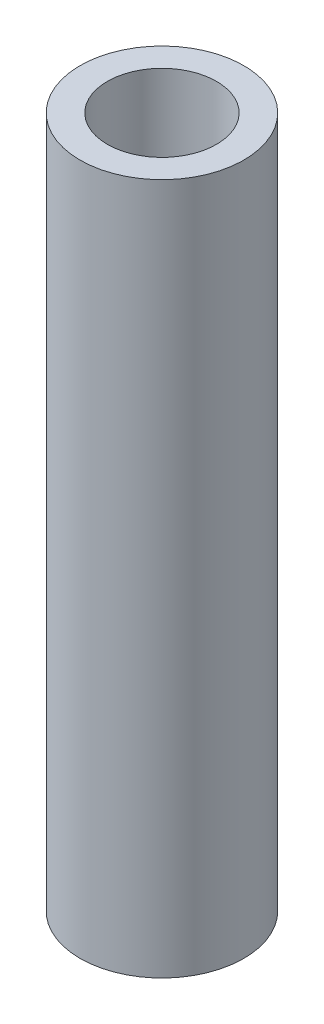
ISO-10303-21;
HEADER;
FILE_DESCRIPTION(('STEP AP214'),'2;1');
FILE_NAME('part.step','',(''),(''),'','','');
FILE_SCHEMA(('AUTOMOTIVE_DESIGN { 1 0 10303 214 1 1 1 1 }'));
ENDSEC;
DATA;
#1=APPLICATION_CONTEXT('core data for automotive mechanical design processes');
#2=APPLICATION_PROTOCOL_DEFINITION('international standard','automotive_design',2000,#1);
#3=PRODUCT_CONTEXT('',#1,'mechanical');
#4=PRODUCT('Part','Part','',(#3));
#5=PRODUCT_RELATED_PRODUCT_CATEGORY('part','',(#4));
#6=PRODUCT_DEFINITION_FORMATION('','',#4);
#7=PRODUCT_DEFINITION_CONTEXT('part definition',#1,'design');
#8=PRODUCT_DEFINITION('design','',#6,#7);
#9=PRODUCT_DEFINITION_SHAPE('','',#8);
#10=(LENGTH_UNIT() NAMED_UNIT(*) SI_UNIT(.MILLI.,.METRE.));
#11=(NAMED_UNIT(*) PLANE_ANGLE_UNIT() SI_UNIT($,.RADIAN.));
#12=(NAMED_UNIT(*) SI_UNIT($,.STERADIAN.) SOLID_ANGLE_UNIT());
#13=UNCERTAINTY_MEASURE_WITH_UNIT(LENGTH_MEASURE(1.E-05),#10,'distance_accuracy_value','');
#14=(GEOMETRIC_REPRESENTATION_CONTEXT(3) GLOBAL_UNCERTAINTY_ASSIGNED_CONTEXT((#13)) GLOBAL_UNIT_ASSIGNED_CONTEXT((#10,
#11,#12)) REPRESENTATION_CONTEXT('',''));
#15=CARTESIAN_POINT('',(0.,0.,0.));
#16=DIRECTION('',(0.,0.,1.));
#17=DIRECTION('',(1.,0.,0.));
#18=AXIS2_PLACEMENT_3D('',#15,#16,#17);
#19=CARTESIAN_POINT('',(0.,19.,0.));
#20=DIRECTION('',(0.,1.,0.));
#21=DIRECTION('',(0.,0.,1.));
#22=AXIS2_PLACEMENT_3D('',#19,#20,#21);
#23=PLANE('',#22);
#24=CARTESIAN_POINT('',(0.,19.,0.));
#25=DIRECTION('',(0.,1.,0.));
#26=DIRECTION('',(0.,0.,1.));
#27=AXIS2_PLACEMENT_3D('',#24,#25,#26);
#28=CIRCLE('',#27,2.25000000000009);
#29=CARTESIAN_POINT('',(0.,19.,2.25000000000009));
#30=VERTEX_POINT('',#29);
#31=EDGE_CURVE('E10',#30,#30,#28,.T.);
#32=ORIENTED_EDGE('',*,*,#31,.T.);
#33=EDGE_LOOP('',(#32));
#34=FACE_BOUND('',#33,.T.);
#35=CARTESIAN_POINT('',(0.,19.,0.));
#36=DIRECTION('',(0.,1.,0.));
#37=DIRECTION('',(0.,0.,1.));
#38=AXIS2_PLACEMENT_3D('',#35,#36,#37);
#39=CIRCLE('',#38,1.50000000000006);
#40=CARTESIAN_POINT('',(0.,19.,1.50000000000006));
#41=VERTEX_POINT('',#40);
#42=EDGE_CURVE('E42',#41,#41,#39,.T.);
#43=ORIENTED_EDGE('',*,*,#42,.F.);
#44=EDGE_LOOP('',(#43));
#45=FACE_BOUND('',#44,.T.);
#46=ADVANCED_FACE('F31',(#34,#45),#23,.T.);
#47=CARTESIAN_POINT('',(0.,0.,0.));
#48=DIRECTION('',(0.,1.,0.));
#49=DIRECTION('',(0.,0.,1.));
#50=AXIS2_PLACEMENT_3D('',#47,#48,#49);
#51=PLANE('',#50);
#52=CARTESIAN_POINT('',(0.,0.,0.));
#53=DIRECTION('',(0.,1.,0.));
#54=DIRECTION('',(0.,0.,1.));
#55=AXIS2_PLACEMENT_3D('',#52,#53,#54);
#56=CIRCLE('',#55,2.25000000000009);
#57=CARTESIAN_POINT('',(0.,0.,2.25000000000009));
#58=VERTEX_POINT('',#57);
#59=EDGE_CURVE('E35',#58,#58,#56,.T.);
#60=ORIENTED_EDGE('',*,*,#59,.F.);
#61=EDGE_LOOP('',(#60));
#62=FACE_BOUND('',#61,.T.);
#63=CARTESIAN_POINT('',(0.,0.,0.));
#64=DIRECTION('',(0.,1.,0.));
#65=DIRECTION('',(0.,0.,1.));
#66=AXIS2_PLACEMENT_3D('',#63,#64,#65);
#67=CIRCLE('',#66,1.50000000000006);
#68=CARTESIAN_POINT('',(0.,0.,1.50000000000006));
#69=VERTEX_POINT('',#68);
#70=EDGE_CURVE('E44',#69,#69,#67,.T.);
#71=ORIENTED_EDGE('',*,*,#70,.T.);
#72=EDGE_LOOP('',(#71));
#73=FACE_BOUND('',#72,.T.);
#74=ADVANCED_FACE('F54',(#62,#73),#51,.F.);
#75=CARTESIAN_POINT('',(0.,19.,0.));
#76=DIRECTION('',(0.,-1.,0.));
#77=DIRECTION('',(0.,0.,-1.));
#78=AXIS2_PLACEMENT_3D('',#75,#76,#77);
#79=CYLINDRICAL_SURFACE('',#78,2.25000000000009);
#80=ORIENTED_EDGE('',*,*,#31,.F.);
#81=EDGE_LOOP('',(#80));
#82=FACE_BOUND('',#81,.T.);
#83=ORIENTED_EDGE('',*,*,#59,.T.);
#84=EDGE_LOOP('',(#83));
#85=FACE_BOUND('',#84,.T.);
#86=ADVANCED_FACE('F33',(#82,#85),#79,.T.);
#87=CARTESIAN_POINT('',(0.,19.,0.));
#88=DIRECTION('',(0.,-1.,0.));
#89=DIRECTION('',(0.,0.,-1.));
#90=AXIS2_PLACEMENT_3D('',#87,#88,#89);
#91=CYLINDRICAL_SURFACE('',#90,1.50000000000006);
#92=ORIENTED_EDGE('',*,*,#42,.T.);
#93=EDGE_LOOP('',(#92));
#94=FACE_BOUND('',#93,.T.);
#95=ORIENTED_EDGE('',*,*,#70,.F.);
#96=EDGE_LOOP('',(#95));
#97=FACE_BOUND('',#96,.T.);
#98=ADVANCED_FACE('F50',(#94,#97),#91,.F.);
#99=CLOSED_SHELL('',(#46,#74,#86,#98));
#100=MANIFOLD_SOLID_BREP('B2',#99);
#101=ADVANCED_BREP_SHAPE_REPRESENTATION('',(#18,#100),#14);
#102=SHAPE_DEFINITION_REPRESENTATION(#9,#101);
ENDSEC;
END-ISO-10303-21;
